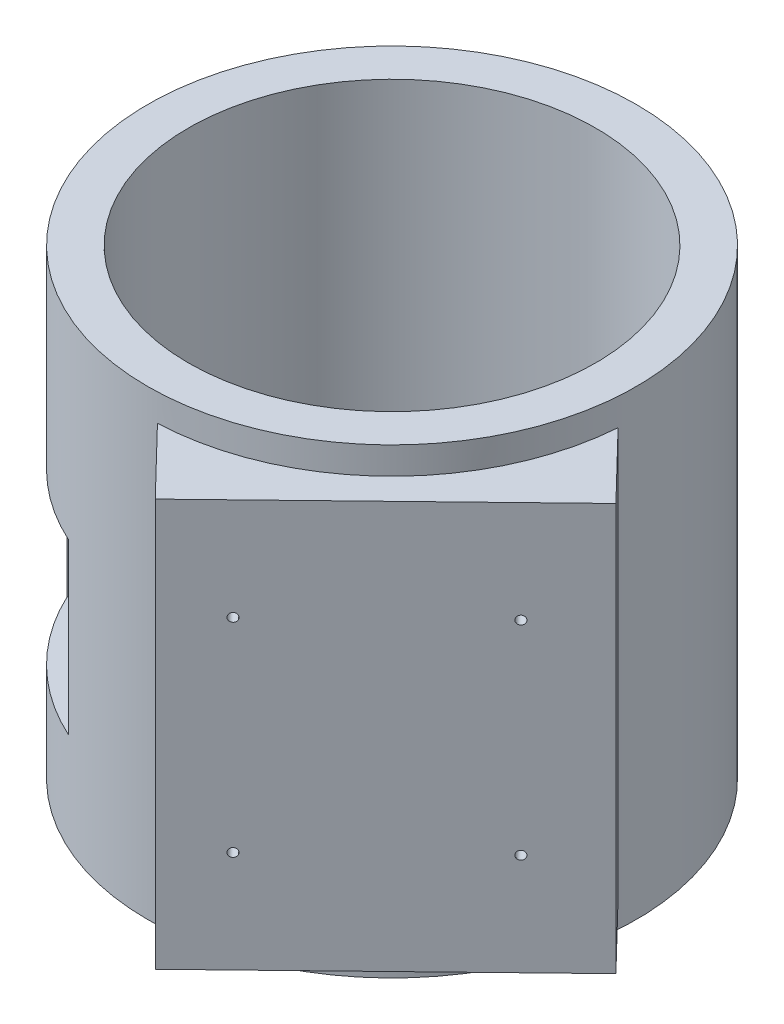
ISO-10303-21;
HEADER;
FILE_DESCRIPTION(('STEP AP214'),'2;1');
FILE_NAME('part.step','',(''),(''),'','','');
FILE_SCHEMA(('AUTOMOTIVE_DESIGN { 1 0 10303 214 1 1 1 1 }'));
ENDSEC;
DATA;
#1=APPLICATION_CONTEXT('core data for automotive mechanical design processes');
#2=APPLICATION_PROTOCOL_DEFINITION('international standard','automotive_design',2000,#1);
#3=PRODUCT_CONTEXT('',#1,'mechanical');
#4=PRODUCT('Part','Part','',(#3));
#5=PRODUCT_RELATED_PRODUCT_CATEGORY('part','',(#4));
#6=PRODUCT_DEFINITION_FORMATION('','',#4);
#7=PRODUCT_DEFINITION_CONTEXT('part definition',#1,'design');
#8=PRODUCT_DEFINITION('design','',#6,#7);
#9=PRODUCT_DEFINITION_SHAPE('','',#8);
#10=(LENGTH_UNIT() NAMED_UNIT(*) SI_UNIT(.MILLI.,.METRE.));
#11=(NAMED_UNIT(*) PLANE_ANGLE_UNIT() SI_UNIT($,.RADIAN.));
#12=(NAMED_UNIT(*) SI_UNIT($,.STERADIAN.) SOLID_ANGLE_UNIT());
#13=UNCERTAINTY_MEASURE_WITH_UNIT(LENGTH_MEASURE(1.E-05),#10,'distance_accuracy_value','');
#14=(GEOMETRIC_REPRESENTATION_CONTEXT(3) GLOBAL_UNCERTAINTY_ASSIGNED_CONTEXT((#13)) GLOBAL_UNIT_ASSIGNED_CONTEXT((#10,
#11,#12)) REPRESENTATION_CONTEXT('',''));
#15=CARTESIAN_POINT('',(0.,0.,0.));
#16=DIRECTION('',(0.,0.,1.));
#17=DIRECTION('',(1.,0.,0.));
#18=AXIS2_PLACEMENT_3D('',#15,#16,#17);
#19=CARTESIAN_POINT('',(0.,226.75,0.));
#20=DIRECTION('',(0.,1.,0.));
#21=DIRECTION('',(0.,0.,1.));
#22=AXIS2_PLACEMENT_3D('',#19,#20,#21);
#23=PLANE('',#22);
#24=CARTESIAN_POINT('',(0.,226.75,0.));
#25=DIRECTION('',(0.,1.,0.));
#26=DIRECTION('',(0.,0.,1.));
#27=AXIS2_PLACEMENT_3D('',#24,#25,#26);
#28=CIRCLE('',#27,120.);
#29=CARTESIAN_POINT('',(0.,226.75,120.));
#30=VERTEX_POINT('',#29);
#31=EDGE_CURVE('E243',#30,#30,#28,.T.);
#32=ORIENTED_EDGE('',*,*,#31,.T.);
#33=EDGE_LOOP('',(#32));
#34=FACE_BOUND('',#33,.T.);
#35=CARTESIAN_POINT('',(0.,226.75,0.));
#36=DIRECTION('',(0.,1.,0.));
#37=DIRECTION('',(0.,0.,1.));
#38=AXIS2_PLACEMENT_3D('',#35,#36,#37);
#39=CIRCLE('',#38,100.);
#40=CARTESIAN_POINT('',(0.,226.75,100.));
#41=VERTEX_POINT('',#40);
#42=EDGE_CURVE('E237',#41,#41,#39,.T.);
#43=ORIENTED_EDGE('',*,*,#42,.F.);
#44=EDGE_LOOP('',(#43));
#45=FACE_BOUND('',#44,.T.);
#46=ADVANCED_FACE('F35',(#34,#45),#23,.T.);
#47=CARTESIAN_POINT('',(0.,0.,0.));
#48=DIRECTION('',(0.,1.,0.));
#49=DIRECTION('',(0.,0.,1.));
#50=AXIS2_PLACEMENT_3D('',#47,#48,#49);
#51=PLANE('',#50);
#52=CARTESIAN_POINT('',(0.,0.,0.));
#53=DIRECTION('',(0.,1.,0.));
#54=DIRECTION('',(0.,0.,1.));
#55=AXIS2_PLACEMENT_3D('',#52,#53,#54);
#56=CIRCLE('',#55,120.);
#57=CARTESIAN_POINT('',(0.,0.,120.));
#58=VERTEX_POINT('',#57);
#59=EDGE_CURVE('E240',#58,#58,#56,.T.);
#60=ORIENTED_EDGE('',*,*,#59,.F.);
#61=EDGE_LOOP('',(#60));
#62=FACE_BOUND('',#61,.T.);
#63=CARTESIAN_POINT('',(0.,0.,0.));
#64=DIRECTION('',(0.,1.,0.));
#65=DIRECTION('',(0.,0.,1.));
#66=AXIS2_PLACEMENT_3D('',#63,#64,#65);
#67=CIRCLE('',#66,100.);
#68=CARTESIAN_POINT('',(0.,0.,100.));
#69=VERTEX_POINT('',#68);
#70=EDGE_CURVE('E236',#69,#69,#67,.T.);
#71=ORIENTED_EDGE('',*,*,#70,.T.);
#72=EDGE_LOOP('',(#71));
#73=FACE_BOUND('',#72,.T.);
#74=ADVANCED_FACE('F291',(#62,#73),#51,.F.);
#75=CARTESIAN_POINT('',(0.,226.75,0.));
#76=DIRECTION('',(0.,-1.,0.));
#77=DIRECTION('',(0.,0.,-1.));
#78=AXIS2_PLACEMENT_3D('',#75,#76,#77);
#79=CYLINDRICAL_SURFACE('',#78,120.);
#80=DIRECTION('',(0.,-1.,0.));
#81=VECTOR('',#80,1.);
#82=CARTESIAN_POINT('',(-108.663981558483,226.75,50.9130544345721));
#83=LINE('',#82,#81);
#84=CARTESIAN_POINT('',(-108.663981558483,48.41,50.9130544345721));
#85=VERTEX_POINT('',#84);
#86=CARTESIAN_POINT('',(-108.663981558483,131.41,50.9130544345721));
#87=VERTEX_POINT('',#86);
#88=EDGE_CURVE('E164',#85,#87,#83,.F.);
#89=ORIENTED_EDGE('',*,*,#88,.T.);
#90=CARTESIAN_POINT('',(0.,131.41,0.));
#91=DIRECTION('',(0.,1.,0.));
#92=DIRECTION('',(0.,0.,1.));
#93=AXIS2_PLACEMENT_3D('',#90,#91,#92);
#94=CIRCLE('',#93,120.);
#95=CARTESIAN_POINT('',(-49.608939813541,131.41,109.265516475128));
#96=VERTEX_POINT('',#95);
#97=EDGE_CURVE('E49',#87,#96,#94,.T.);
#98=ORIENTED_EDGE('',*,*,#97,.T.);
#99=DIRECTION('',(0.,-1.,0.));
#100=VECTOR('',#99,1.);
#101=CARTESIAN_POINT('',(-49.608939813541,226.75,109.265516475128));
#102=LINE('',#101,#100);
#103=CARTESIAN_POINT('',(-49.608939813541,48.41,109.265516475128));
#104=VERTEX_POINT('',#103);
#105=EDGE_CURVE('E11',#96,#104,#102,.T.);
#106=ORIENTED_EDGE('',*,*,#105,.T.);
#107=CARTESIAN_POINT('',(0.,48.41,0.));
#108=DIRECTION('',(0.,-1.,0.));
#109=DIRECTION('',(0.,0.,-1.));
#110=AXIS2_PLACEMENT_3D('',#107,#108,#109);
#111=CIRCLE('',#110,120.);
#112=EDGE_CURVE('E166',#104,#85,#111,.T.);
#113=ORIENTED_EDGE('',*,*,#112,.T.);
#114=EDGE_LOOP('',(#89,#98,#106,#113));
#115=FACE_BOUND('',#114,.T.);
#116=CARTESIAN_POINT('',(0.,213.414213562373,0.));
#117=DIRECTION('',(0.,1.,0.));
#118=DIRECTION('',(-1.,0.,0.));
#119=AXIS2_PLACEMENT_3D('',#116,#117,#118);
#120=CIRCLE('',#119,120.);
#121=CARTESIAN_POINT('',(4.6899926602656,213.414213562373,119.908314844495));
#122=VERTEX_POINT('',#121);
#123=CARTESIAN_POINT('',(119.686951655469,213.414213562374,8.66219391501968));
#124=VERTEX_POINT('',#123);
#125=EDGE_CURVE('E219',#122,#124,#120,.T.);
#126=ORIENTED_EDGE('',*,*,#125,.T.);
#127=DIRECTION('',(0.,-1.,0.));
#128=VECTOR('',#127,1.);
#129=CARTESIAN_POINT('',(119.686951655469,226.75,8.66219391501962));
#130=LINE('',#129,#128);
#131=CARTESIAN_POINT('',(119.686951655469,13.4142135623721,8.6621939150195));
#132=VERTEX_POINT('',#131);
#133=EDGE_CURVE('E233',#124,#132,#130,.T.);
#134=ORIENTED_EDGE('',*,*,#133,.T.);
#135=CARTESIAN_POINT('',(0.,13.4142135623726,0.));
#136=DIRECTION('',(0.,-1.,0.));
#137=DIRECTION('',(1.,0.,0.));
#138=AXIS2_PLACEMENT_3D('',#135,#136,#137);
#139=CIRCLE('',#138,120.);
#140=CARTESIAN_POINT('',(4.68999266026526,13.4142135623732,119.908314844496));
#141=VERTEX_POINT('',#140);
#142=EDGE_CURVE('E230',#132,#141,#139,.T.);
#143=ORIENTED_EDGE('',*,*,#142,.T.);
#144=DIRECTION('',(0.,-1.,0.));
#145=VECTOR('',#144,1.);
#146=CARTESIAN_POINT('',(4.68999266026567,226.75,119.908314844495));
#147=LINE('',#146,#145);
#148=EDGE_CURVE('E227',#141,#122,#147,.F.);
#149=ORIENTED_EDGE('',*,*,#148,.T.);
#150=EDGE_LOOP('',(#126,#134,#143,#149));
#151=FACE_BOUND('',#150,.T.);
#152=ORIENTED_EDGE('',*,*,#31,.F.);
#153=EDGE_LOOP('',(#152));
#154=FACE_BOUND('',#153,.T.);
#155=ORIENTED_EDGE('',*,*,#59,.T.);
#156=EDGE_LOOP('',(#155));
#157=FACE_BOUND('',#156,.T.);
#158=ADVANCED_FACE('F37',(#115,#151,#154,#157),#79,.T.);
#159=CARTESIAN_POINT('',(0.,226.75,0.));
#160=DIRECTION('',(0.,-1.,0.));
#161=DIRECTION('',(0.,0.,-1.));
#162=AXIS2_PLACEMENT_3D('',#159,#160,#161);
#163=CYLINDRICAL_SURFACE('',#162,100.);
#164=CARTESIAN_POINT('',(0.,48.41,0.));
#165=DIRECTION('',(0.,-1.,0.));
#166=DIRECTION('',(0.,0.,-1.));
#167=AXIS2_PLACEMENT_3D('',#164,#165,#166);
#168=CIRCLE('',#167,100.);
#169=CARTESIAN_POINT('',(-36.5772958110317,48.41,93.0704111474333));
#170=VERTEX_POINT('',#169);
#171=CARTESIAN_POINT('',(-93.2824171625184,48.41,36.0331881508964));
#172=VERTEX_POINT('',#171);
#173=EDGE_CURVE('E43',#170,#172,#168,.T.);
#174=ORIENTED_EDGE('',*,*,#173,.F.);
#175=DIRECTION('',(0.,-1.,0.));
#176=VECTOR('',#175,1.);
#177=CARTESIAN_POINT('',(-36.5772958110317,226.75,93.0704111474333));
#178=LINE('',#177,#176);
#179=CARTESIAN_POINT('',(-36.5772958110317,131.41,93.0704111474333));
#180=VERTEX_POINT('',#179);
#181=EDGE_CURVE('E246',#170,#180,#178,.F.);
#182=ORIENTED_EDGE('',*,*,#181,.T.);
#183=CARTESIAN_POINT('',(0.,131.41,0.));
#184=DIRECTION('',(0.,1.,0.));
#185=DIRECTION('',(0.,0.,1.));
#186=AXIS2_PLACEMENT_3D('',#183,#184,#185);
#187=CIRCLE('',#186,100.);
#188=CARTESIAN_POINT('',(-93.2824171625184,131.41,36.0331881508964));
#189=VERTEX_POINT('',#188);
#190=EDGE_CURVE('E142',#189,#180,#187,.T.);
#191=ORIENTED_EDGE('',*,*,#190,.F.);
#192=DIRECTION('',(0.,-1.,0.));
#193=VECTOR('',#192,1.);
#194=CARTESIAN_POINT('',(-93.2824171625184,226.75,36.0331881508963));
#195=LINE('',#194,#193);
#196=EDGE_CURVE('E251',#172,#189,#195,.F.);
#197=ORIENTED_EDGE('',*,*,#196,.F.);
#198=EDGE_LOOP('',(#174,#182,#191,#197));
#199=FACE_BOUND('',#198,.T.);
#200=ORIENTED_EDGE('',*,*,#42,.T.);
#201=EDGE_LOOP('',(#200));
#202=FACE_BOUND('',#201,.T.);
#203=ORIENTED_EDGE('',*,*,#70,.F.);
#204=EDGE_LOOP('',(#203));
#205=FACE_BOUND('',#204,.T.);
#206=CARTESIAN_POINT('',(0.,203.414213562373,0.));
#207=DIRECTION('',(0.,1.,0.));
#208=DIRECTION('',(0.,0.,1.));
#209=AXIS2_PLACEMENT_3D('',#206,#207,#208);
#210=CIRCLE('',#209,99.9999999999977);
#211=CARTESIAN_POINT('',(-0.657656399723929,203.414213562373,99.9978374169134));
#212=VERTEX_POINT('',#211);
#213=CARTESIAN_POINT('',(99.9646827210788,203.414213562373,2.65748160362182));
#214=VERTEX_POINT('',#213);
#215=EDGE_CURVE('E184',#212,#214,#210,.T.);
#216=ORIENTED_EDGE('',*,*,#215,.F.);
#217=DIRECTION('',(0.,1.,0.));
#218=VECTOR('',#217,1.);
#219=CARTESIAN_POINT('',(-0.657656399723934,0.,99.9978374169134));
#220=LINE('',#219,#218);
#221=CARTESIAN_POINT('',(-0.657656399723906,23.414213562373,99.9978374169134));
#222=VERTEX_POINT('',#221);
#223=EDGE_CURVE('E183',#222,#212,#220,.T.);
#224=ORIENTED_EDGE('',*,*,#223,.F.);
#225=CARTESIAN_POINT('',(0.,23.4142135623732,0.));
#226=DIRECTION('',(0.,-1.,0.));
#227=DIRECTION('',(1.,0.,0.));
#228=AXIS2_PLACEMENT_3D('',#225,#226,#227);
#229=CIRCLE('',#228,99.9999999999977);
#230=CARTESIAN_POINT('',(99.9646827210788,23.4142135623735,2.65748160362216));
#231=VERTEX_POINT('',#230);
#232=EDGE_CURVE('E180',#231,#222,#229,.T.);
#233=ORIENTED_EDGE('',*,*,#232,.F.);
#234=DIRECTION('',(0.,1.,0.));
#235=VECTOR('',#234,1.);
#236=CARTESIAN_POINT('',(99.9646827210788,0.,2.65748160362216));
#237=LINE('',#236,#235);
#238=EDGE_CURVE('E187',#214,#231,#237,.F.);
#239=ORIENTED_EDGE('',*,*,#238,.F.);
#240=EDGE_LOOP('',(#216,#224,#233,#239));
#241=FACE_BOUND('',#240,.T.);
#242=ADVANCED_FACE('F261',(#199,#202,#205,#241),#163,.F.);
#243=CARTESIAN_POINT('',(-67.6679309128779,23.4142135623732,-170.627129448513));
#244=DIRECTION('',(0.718730993720023,0.,-0.69528825580922));
#245=DIRECTION('',(-0.69528825580922,0.,-0.718730993720023));
#246=AXIS2_PLACEMENT_3D('',#243,#244,#245);
#247=PLANE('',#246);
#248=DIRECTION('',(0.69528825580922,0.,0.718730993720023));
#249=VECTOR('',#248,1.);
#250=CARTESIAN_POINT('',(-67.6679309128777,203.414213562373,-170.627129448514));
#251=LINE('',#250,#249);
#252=CARTESIAN_POINT('',(137.250013066787,203.414213562373,41.1999455481055));
#253=VERTEX_POINT('',#252);
#254=EDGE_CURVE('E212',#214,#253,#251,.T.);
#255=ORIENTED_EDGE('',*,*,#254,.F.);
#256=ORIENTED_EDGE('',*,*,#238,.T.);
#257=DIRECTION('',(0.69528825580922,0.,0.718730993720023));
#258=VECTOR('',#257,1.);
#259=CARTESIAN_POINT('',(-67.6679309128779,23.4142135623732,-170.627129448513));
#260=LINE('',#259,#258);
#261=CARTESIAN_POINT('',(137.250013066786,23.4142135623732,41.1999455481056));
#262=VERTEX_POINT('',#261);
#263=EDGE_CURVE('E204',#231,#262,#260,.T.);
#264=ORIENTED_EDGE('',*,*,#263,.T.);
#265=DIRECTION('',(0.,1.,0.));
#266=VECTOR('',#265,1.);
#267=CARTESIAN_POINT('',(137.250013066786,23.4142135623732,41.1999455481056));
#268=LINE('',#267,#266);
#269=EDGE_CURVE('E192',#262,#253,#268,.T.);
#270=ORIENTED_EDGE('',*,*,#269,.T.);
#271=EDGE_LOOP('',(#255,#256,#264,#270));
#272=FACE_BOUND('',#271,.T.);
#273=ADVANCED_FACE('F264',(#272),#247,.F.);
#274=CARTESIAN_POINT('',(-128.76006537908,203.414213562373,-111.52762770473));
#275=DIRECTION('',(0.,1.,0.));
#276=DIRECTION('',(0.,0.,1.));
#277=AXIS2_PLACEMENT_3D('',#274,#275,#276);
#278=PLANE('',#277);
#279=DIRECTION('',(0.69528825580922,0.,0.718730993720023));
#280=VECTOR('',#279,1.);
#281=CARTESIAN_POINT('',(-168.290270033681,203.414213562373,-73.2867736352227));
#282=LINE('',#281,#280);
#283=CARTESIAN_POINT('',(36.6276739459833,203.414213562373,138.540301361396));
#284=VERTEX_POINT('',#283);
#285=EDGE_CURVE('E209',#212,#284,#282,.T.);
#286=ORIENTED_EDGE('',*,*,#285,.F.);
#287=ORIENTED_EDGE('',*,*,#215,.T.);
#288=ORIENTED_EDGE('',*,*,#254,.T.);
#289=DIRECTION('',(-0.718730993720023,0.,0.69528825580922));
#290=VECTOR('',#289,1.);
#291=CARTESIAN_POINT('',(76.1578786005845,203.414213562373,100.299447291889));
#292=LINE('',#291,#290);
#293=EDGE_CURVE('E195',#253,#284,#292,.T.);
#294=ORIENTED_EDGE('',*,*,#293,.T.);
#295=EDGE_LOOP('',(#286,#287,#288,#294));
#296=FACE_BOUND('',#295,.T.);
#297=ADVANCED_FACE('F276',(#296),#278,.F.);
#298=CARTESIAN_POINT('',(-168.290270033681,203.414213562373,-73.2867736352227));
#299=DIRECTION('',(-0.718730993720023,0.,0.69528825580922));
#300=DIRECTION('',(0.69528825580922,0.,0.718730993720023));
#301=AXIS2_PLACEMENT_3D('',#298,#299,#300);
#302=PLANE('',#301);
#303=DIRECTION('',(0.69528825580922,0.,0.718730993720023));
#304=VECTOR('',#303,1.);
#305=CARTESIAN_POINT('',(-168.290270033681,23.414213562373,-73.2867736352227));
#306=LINE('',#305,#304);
#307=CARTESIAN_POINT('',(36.6276739459834,23.4142135623729,138.540301361396));
#308=VERTEX_POINT('',#307);
#309=EDGE_CURVE('E205',#222,#308,#306,.T.);
#310=ORIENTED_EDGE('',*,*,#309,.F.);
#311=ORIENTED_EDGE('',*,*,#223,.T.);
#312=ORIENTED_EDGE('',*,*,#285,.T.);
#313=DIRECTION('',(0.,-1.,0.));
#314=VECTOR('',#313,1.);
#315=CARTESIAN_POINT('',(36.6276739459832,203.414213562373,138.540301361396));
#316=LINE('',#315,#314);
#317=EDGE_CURVE('E198',#284,#308,#316,.T.);
#318=ORIENTED_EDGE('',*,*,#317,.T.);
#319=EDGE_LOOP('',(#310,#311,#312,#318));
#320=FACE_BOUND('',#319,.T.);
#321=ADVANCED_FACE('F275',(#320),#302,.F.);
#322=CARTESIAN_POINT('',(-168.290270033681,23.414213562373,-73.2867736352227));
#323=DIRECTION('',(0.,-1.,0.));
#324=DIRECTION('',(1.,0.,0.));
#325=AXIS2_PLACEMENT_3D('',#322,#323,#324);
#326=PLANE('',#325);
#327=ORIENTED_EDGE('',*,*,#263,.F.);
#328=ORIENTED_EDGE('',*,*,#232,.T.);
#329=ORIENTED_EDGE('',*,*,#309,.T.);
#330=DIRECTION('',(0.718730993720025,0.,-0.695288255809218));
#331=VECTOR('',#330,1.);
#332=CARTESIAN_POINT('',(36.627673945983,23.4142135623729,138.540301361396));
#333=LINE('',#332,#331);
#334=EDGE_CURVE('E201',#308,#262,#333,.T.);
#335=ORIENTED_EDGE('',*,*,#334,.T.);
#336=EDGE_LOOP('',(#327,#328,#329,#335));
#337=FACE_BOUND('',#336,.T.);
#338=ADVANCED_FACE('F281',(#337),#326,.F.);
#339=CARTESIAN_POINT('',(-60.4806209756777,213.414213562374,-177.580012006606));
#340=DIRECTION('',(0.718730993720023,0.,-0.69528825580922));
#341=DIRECTION('',(-0.69528825580922,0.,-0.718730993720023));
#342=AXIS2_PLACEMENT_3D('',#339,#340,#341);
#343=PLANE('',#342);
#344=ORIENTED_EDGE('',*,*,#133,.F.);
#345=DIRECTION('',(0.69528825580922,0.,0.718730993720023));
#346=VECTOR('',#345,1.);
#347=CARTESIAN_POINT('',(-60.4806209756777,213.414213562374,-177.580012006606));
#348=LINE('',#347,#346);
#349=CARTESIAN_POINT('',(151.390205562079,213.414213562374,41.4343729272136));
#350=VERTEX_POINT('',#349);
#351=EDGE_CURVE('E222',#124,#350,#348,.T.);
#352=ORIENTED_EDGE('',*,*,#351,.T.);
#353=DIRECTION('',(0.,1.,0.));
#354=VECTOR('',#353,1.);
#355=CARTESIAN_POINT('',(151.390205562079,13.4142135623723,41.4343729272137));
#356=LINE('',#355,#354);
#357=CARTESIAN_POINT('',(151.390205562079,13.4142135623723,41.4343729272137));
#358=VERTEX_POINT('',#357);
#359=EDGE_CURVE('E174',#358,#350,#356,.T.);
#360=ORIENTED_EDGE('',*,*,#359,.F.);
#361=DIRECTION('',(0.69528825580922,0.,0.718730993720023));
#362=VECTOR('',#361,1.);
#363=CARTESIAN_POINT('',(-60.4806209756777,13.4142135623723,-177.580012006606));
#364=LINE('',#363,#362);
#365=EDGE_CURVE('E208',#132,#358,#364,.T.);
#366=ORIENTED_EDGE('',*,*,#365,.F.);
#367=EDGE_LOOP('',(#344,#352,#360,#366));
#368=FACE_BOUND('',#367,.T.);
#369=ADVANCED_FACE('F306',(#368),#343,.T.);
#370=CARTESIAN_POINT('',(-175.477579970882,13.4142135623732,-66.3338910771298));
#371=DIRECTION('',(-0.718730993720023,0.,0.69528825580922));
#372=DIRECTION('',(0.69528825580922,0.,0.718730993720023));
#373=AXIS2_PLACEMENT_3D('',#370,#371,#372);
#374=PLANE('',#373);
#375=ORIENTED_EDGE('',*,*,#148,.F.);
#376=DIRECTION('',(0.69528825580922,0.,0.718730993720023));
#377=VECTOR('',#376,1.);
#378=CARTESIAN_POINT('',(-175.477579970882,13.4142135623732,-66.3338910771298));
#379=LINE('',#378,#377);
#380=CARTESIAN_POINT('',(36.3932465668747,13.4142135623731,152.680493856689));
#381=VERTEX_POINT('',#380);
#382=EDGE_CURVE('E217',#141,#381,#379,.T.);
#383=ORIENTED_EDGE('',*,*,#382,.T.);
#384=DIRECTION('',(0.,-1.,0.));
#385=VECTOR('',#384,1.);
#386=CARTESIAN_POINT('',(36.3932465668751,213.414213562373,152.680493856689));
#387=LINE('',#386,#385);
#388=CARTESIAN_POINT('',(36.3932465668751,213.414213562373,152.680493856689));
#389=VERTEX_POINT('',#388);
#390=EDGE_CURVE('E168',#389,#381,#387,.T.);
#391=ORIENTED_EDGE('',*,*,#390,.F.);
#392=DIRECTION('',(0.69528825580922,0.,0.718730993720023));
#393=VECTOR('',#392,1.);
#394=CARTESIAN_POINT('',(-175.477579970881,213.414213562373,-66.3338910771302));
#395=LINE('',#394,#393);
#396=EDGE_CURVE('E220',#122,#389,#395,.T.);
#397=ORIENTED_EDGE('',*,*,#396,.F.);
#398=EDGE_LOOP('',(#375,#383,#391,#397));
#399=FACE_BOUND('',#398,.T.);
#400=ADVANCED_FACE('F309',(#399),#374,.T.);
#401=CARTESIAN_POINT('',(-175.477579970881,213.414213562373,-66.3338910771302));
#402=DIRECTION('',(0.,1.,0.));
#403=DIRECTION('',(-1.,0.,0.));
#404=AXIS2_PLACEMENT_3D('',#401,#402,#403);
#405=PLANE('',#404);
#406=ORIENTED_EDGE('',*,*,#125,.F.);
#407=ORIENTED_EDGE('',*,*,#396,.T.);
#408=DIRECTION('',(-0.718730993720023,0.,0.695288255809221));
#409=VECTOR('',#408,1.);
#410=CARTESIAN_POINT('',(151.390205562079,213.414213562374,41.4343729272136));
#411=LINE('',#410,#409);
#412=EDGE_CURVE('E177',#350,#389,#411,.T.);
#413=ORIENTED_EDGE('',*,*,#412,.F.);
#414=ORIENTED_EDGE('',*,*,#351,.F.);
#415=EDGE_LOOP('',(#406,#407,#413,#414));
#416=FACE_BOUND('',#415,.T.);
#417=ADVANCED_FACE('F304',(#416),#405,.T.);
#418=CARTESIAN_POINT('',(-60.4806209756777,13.4142135623723,-177.580012006606));
#419=DIRECTION('',(0.,-1.,0.));
#420=DIRECTION('',(1.,0.,0.));
#421=AXIS2_PLACEMENT_3D('',#418,#419,#420);
#422=PLANE('',#421);
#423=ORIENTED_EDGE('',*,*,#142,.F.);
#424=ORIENTED_EDGE('',*,*,#365,.T.);
#425=DIRECTION('',(0.718730993720023,0.,-0.69528825580922));
#426=VECTOR('',#425,1.);
#427=CARTESIAN_POINT('',(36.3932465668747,13.4142135623731,152.680493856689));
#428=LINE('',#427,#426);
#429=EDGE_CURVE('E171',#381,#358,#428,.T.);
#430=ORIENTED_EDGE('',*,*,#429,.F.);
#431=ORIENTED_EDGE('',*,*,#382,.F.);
#432=EDGE_LOOP('',(#423,#424,#430,#431));
#433=FACE_BOUND('',#432,.T.);
#434=ADVANCED_FACE('F300',(#433),#422,.T.);
#435=CARTESIAN_POINT('',(93.8917260644768,0.,97.0574333919515));
#436=DIRECTION('',(0.69528825580922,0.,0.718730993720023));
#437=DIRECTION('',(0.718730993720023,0.,-0.69528825580922));
#438=AXIS2_PLACEMENT_3D('',#435,#436,#437);
#439=PLANE('',#438);
#440=CARTESIAN_POINT('',(55.7989833973156,163.414213562373,133.90771094984));
#441=DIRECTION('',(0.69528825580922,0.,0.718730993720023));
#442=DIRECTION('',(0.718730993720023,0.,-0.69528825580922));
#443=AXIS2_PLACEMENT_3D('',#440,#441,#442);
#444=CIRCLE('',#443,2.09999999999996);
#445=CARTESIAN_POINT('',(57.3083184841277,163.414213562373,132.447605612641));
#446=VERTEX_POINT('',#445);
#447=EDGE_CURVE('E488',#446,#446,#444,.T.);
#448=ORIENTED_EDGE('',*,*,#447,.F.);
#449=EDGE_LOOP('',(#448));
#450=FACE_BOUND('',#449,.T.);
#451=CARTESIAN_POINT('',(127.672082769318,163.414213562373,64.378885368918));
#452=DIRECTION('',(0.69528825580922,0.,0.718730993720023));
#453=DIRECTION('',(0.718730993720023,0.,-0.69528825580922));
#454=AXIS2_PLACEMENT_3D('',#451,#452,#453);
#455=CIRCLE('',#454,2.09999999999996);
#456=CARTESIAN_POINT('',(129.18141785613,163.414213562373,62.9187800317187));
#457=VERTEX_POINT('',#456);
#458=EDGE_CURVE('E490',#457,#457,#455,.T.);
#459=ORIENTED_EDGE('',*,*,#458,.F.);
#460=EDGE_LOOP('',(#459));
#461=FACE_BOUND('',#460,.T.);
#462=CARTESIAN_POINT('',(127.672082769318,63.4142135623727,64.378885368918));
#463=DIRECTION('',(0.69528825580922,0.,0.718730993720023));
#464=DIRECTION('',(0.718730993720023,0.,-0.69528825580922));
#465=AXIS2_PLACEMENT_3D('',#462,#463,#464);
#466=CIRCLE('',#465,2.09999999999996);
#467=CARTESIAN_POINT('',(129.18141785613,63.4142135623727,62.9187800317187));
#468=VERTEX_POINT('',#467);
#469=EDGE_CURVE('E498',#468,#468,#466,.T.);
#470=ORIENTED_EDGE('',*,*,#469,.F.);
#471=EDGE_LOOP('',(#470));
#472=FACE_BOUND('',#471,.T.);
#473=CARTESIAN_POINT('',(55.7989833973156,63.4142135623725,133.90771094984));
#474=DIRECTION('',(0.69528825580922,0.,0.718730993720023));
#475=DIRECTION('',(0.718730993720023,0.,-0.69528825580922));
#476=AXIS2_PLACEMENT_3D('',#473,#474,#475);
#477=CIRCLE('',#476,2.09999999999996);
#478=CARTESIAN_POINT('',(57.3083184841276,63.4142135623725,132.447605612641));
#479=VERTEX_POINT('',#478);
#480=EDGE_CURVE('E151',#479,#479,#477,.T.);
#481=ORIENTED_EDGE('',*,*,#480,.F.);
#482=EDGE_LOOP('',(#481));
#483=FACE_BOUND('',#482,.T.);
#484=ORIENTED_EDGE('',*,*,#390,.T.);
#485=ORIENTED_EDGE('',*,*,#429,.T.);
#486=ORIENTED_EDGE('',*,*,#359,.T.);
#487=ORIENTED_EDGE('',*,*,#412,.T.);
#488=EDGE_LOOP('',(#484,#485,#486,#487));
#489=FACE_BOUND('',#488,.T.);
#490=ADVANCED_FACE('F303',(#450,#461,#472,#483,#489),#439,.T.);
#491=CARTESIAN_POINT('',(86.9388435063845,0.,89.8701234547513));
#492=DIRECTION('',(0.69528825580922,0.,0.718730993720023));
#493=DIRECTION('',(0.718730993720023,0.,-0.69528825580922));
#494=AXIS2_PLACEMENT_3D('',#491,#492,#493);
#495=PLANE('',#494);
#496=CARTESIAN_POINT('',(48.8461008392234,163.414213562373,126.72040101264));
#497=DIRECTION('',(0.69528825580922,0.,0.718730993720023));
#498=DIRECTION('',(0.718730993720023,0.,-0.69528825580922));
#499=AXIS2_PLACEMENT_3D('',#496,#497,#498);
#500=CIRCLE('',#499,2.09999999999998);
#501=CARTESIAN_POINT('',(50.3554359260354,163.414213562373,125.260295675441));
#502=VERTEX_POINT('',#501);
#503=EDGE_CURVE('E486',#502,#502,#500,.T.);
#504=ORIENTED_EDGE('',*,*,#503,.T.);
#505=EDGE_LOOP('',(#504));
#506=FACE_BOUND('',#505,.T.);
#507=CARTESIAN_POINT('',(120.719200211226,163.414213562373,57.1915754317178));
#508=DIRECTION('',(0.69528825580922,0.,0.718730993720023));
#509=DIRECTION('',(0.718730993720023,0.,-0.69528825580922));
#510=AXIS2_PLACEMENT_3D('',#507,#508,#509);
#511=CIRCLE('',#510,2.09999999999998);
#512=CARTESIAN_POINT('',(122.228535298038,163.414213562373,55.7314700945184));
#513=VERTEX_POINT('',#512);
#514=EDGE_CURVE('E495',#513,#513,#511,.T.);
#515=ORIENTED_EDGE('',*,*,#514,.T.);
#516=EDGE_LOOP('',(#515));
#517=FACE_BOUND('',#516,.T.);
#518=CARTESIAN_POINT('',(120.719200211226,63.4142135623727,57.1915754317178));
#519=DIRECTION('',(0.69528825580922,0.,0.718730993720023));
#520=DIRECTION('',(0.718730993720023,0.,-0.69528825580922));
#521=AXIS2_PLACEMENT_3D('',#518,#519,#520);
#522=CIRCLE('',#521,2.09999999999998);
#523=CARTESIAN_POINT('',(122.228535298038,63.4142135623727,55.7314700945184));
#524=VERTEX_POINT('',#523);
#525=EDGE_CURVE('E501',#524,#524,#522,.T.);
#526=ORIENTED_EDGE('',*,*,#525,.T.);
#527=EDGE_LOOP('',(#526));
#528=FACE_BOUND('',#527,.T.);
#529=CARTESIAN_POINT('',(48.8461008392234,63.4142135623725,126.72040101264));
#530=DIRECTION('',(0.69528825580922,0.,0.718730993720023));
#531=DIRECTION('',(0.718730993720023,0.,-0.69528825580922));
#532=AXIS2_PLACEMENT_3D('',#529,#530,#531);
#533=CIRCLE('',#532,2.09999999999998);
#534=CARTESIAN_POINT('',(50.3554359260354,63.4142135623725,125.260295675441));
#535=VERTEX_POINT('',#534);
#536=EDGE_CURVE('E148',#535,#535,#533,.T.);
#537=ORIENTED_EDGE('',*,*,#536,.T.);
#538=EDGE_LOOP('',(#537));
#539=FACE_BOUND('',#538,.T.);
#540=ORIENTED_EDGE('',*,*,#293,.F.);
#541=ORIENTED_EDGE('',*,*,#269,.F.);
#542=ORIENTED_EDGE('',*,*,#334,.F.);
#543=ORIENTED_EDGE('',*,*,#317,.F.);
#544=EDGE_LOOP('',(#540,#541,#542,#543));
#545=FACE_BOUND('',#544,.T.);
#546=ADVANCED_FACE('F278',(#506,#517,#528,#539,#545),#495,.F.);
#547=CARTESIAN_POINT('',(-34.7840256426849,131.41,94.9241442420681));
#548=DIRECTION('',(0.695288255809221,0.,0.718730993720023));
#549=DIRECTION('',(0.718730993720023,0.,-0.695288255809221));
#550=AXIS2_PLACEMENT_3D('',#547,#548,#549);
#551=PLANE('',#550);
#552=DIRECTION('',(-0.718730993720023,0.,0.695288255809221));
#553=VECTOR('',#552,1.);
#554=CARTESIAN_POINT('',(-34.7840256426849,131.41,94.9241442420681));
#555=LINE('',#554,#553);
#556=CARTESIAN_POINT('',(-34.7840256426849,131.41,94.9241442420681));
#557=VERTEX_POINT('',#556);
#558=EDGE_CURVE('E131',#557,#96,#555,.T.);
#559=ORIENTED_EDGE('',*,*,#558,.F.);
#560=DIRECTION('',(0.,1.,0.));
#561=VECTOR('',#560,1.);
#562=CARTESIAN_POINT('',(-34.7840256426849,131.41,94.9241442420681));
#563=LINE('',#562,#561);
#564=CARTESIAN_POINT('',(-34.7840256426849,48.41,94.9241442420681));
#565=VERTEX_POINT('',#564);
#566=EDGE_CURVE('E134',#565,#557,#563,.T.);
#567=ORIENTED_EDGE('',*,*,#566,.F.);
#568=DIRECTION('',(-0.718730993720023,0.,0.695288255809221));
#569=VECTOR('',#568,1.);
#570=CARTESIAN_POINT('',(-34.7840256426849,48.41,94.9241442420681));
#571=LINE('',#570,#569);
#572=EDGE_CURVE('E156',#565,#104,#571,.T.);
#573=ORIENTED_EDGE('',*,*,#572,.T.);
#574=ORIENTED_EDGE('',*,*,#105,.F.);
#575=EDGE_LOOP('',(#559,#567,#573,#574));
#576=FACE_BOUND('',#575,.T.);
#577=ADVANCED_FACE('F132',(#576),#551,.F.);
#578=CARTESIAN_POINT('',(-92.4929508748502,48.41,35.2694717633061));
#579=DIRECTION('',(0.,-1.,0.));
#580=DIRECTION('',(0.,0.,-1.));
#581=AXIS2_PLACEMENT_3D('',#578,#579,#580);
#582=PLANE('',#581);
#583=ORIENTED_EDGE('',*,*,#572,.F.);
#584=DIRECTION('',(0.695288255809221,0.,0.718730993720023));
#585=VECTOR('',#584,1.);
#586=CARTESIAN_POINT('',(-92.4929508748502,48.41,35.2694717633061));
#587=LINE('',#586,#585);
#588=EDGE_CURVE('E137',#170,#565,#587,.T.);
#589=ORIENTED_EDGE('',*,*,#588,.F.);
#590=ORIENTED_EDGE('',*,*,#173,.T.);
#591=DIRECTION('',(-0.718730993720023,0.,0.695288255809221));
#592=VECTOR('',#591,1.);
#593=CARTESIAN_POINT('',(-92.4929508748502,48.41,35.2694717633061));
#594=LINE('',#593,#592);
#595=EDGE_CURVE('E158',#172,#85,#594,.T.);
#596=ORIENTED_EDGE('',*,*,#595,.T.);
#597=ORIENTED_EDGE('',*,*,#112,.F.);
#598=EDGE_LOOP('',(#583,#589,#590,#596,#597));
#599=FACE_BOUND('',#598,.T.);
#600=ADVANCED_FACE('F255',(#599),#582,.F.);
#601=CARTESIAN_POINT('',(-92.4929508748502,131.41,35.2694717633061));
#602=DIRECTION('',(-0.695288255809221,0.,-0.718730993720023));
#603=DIRECTION('',(-0.718730993720023,0.,0.695288255809221));
#604=AXIS2_PLACEMENT_3D('',#601,#602,#603);
#605=PLANE('',#604);
#606=ORIENTED_EDGE('',*,*,#595,.F.);
#607=ORIENTED_EDGE('',*,*,#196,.T.);
#608=DIRECTION('',(-0.718730993720023,0.,0.695288255809221));
#609=VECTOR('',#608,1.);
#610=CARTESIAN_POINT('',(-92.4929508748502,131.41,35.2694717633061));
#611=LINE('',#610,#609);
#612=EDGE_CURVE('E136',#189,#87,#611,.T.);
#613=ORIENTED_EDGE('',*,*,#612,.T.);
#614=ORIENTED_EDGE('',*,*,#88,.F.);
#615=EDGE_LOOP('',(#606,#607,#613,#614));
#616=FACE_BOUND('',#615,.T.);
#617=ADVANCED_FACE('F260',(#616),#605,.F.);
#618=CARTESIAN_POINT('',(-92.4929508748502,131.41,35.2694717633061));
#619=DIRECTION('',(0.,1.,0.));
#620=DIRECTION('',(0.,0.,1.));
#621=AXIS2_PLACEMENT_3D('',#618,#619,#620);
#622=PLANE('',#621);
#623=ORIENTED_EDGE('',*,*,#612,.F.);
#624=ORIENTED_EDGE('',*,*,#190,.T.);
#625=DIRECTION('',(-0.695288255809221,0.,-0.718730993720023));
#626=VECTOR('',#625,1.);
#627=CARTESIAN_POINT('',(-92.4929508748502,131.41,35.2694717633061));
#628=LINE('',#627,#626);
#629=EDGE_CURVE('E57',#557,#180,#628,.T.);
#630=ORIENTED_EDGE('',*,*,#629,.F.);
#631=ORIENTED_EDGE('',*,*,#558,.T.);
#632=ORIENTED_EDGE('',*,*,#97,.F.);
#633=EDGE_LOOP('',(#623,#624,#630,#631,#632));
#634=FACE_BOUND('',#633,.T.);
#635=ADVANCED_FACE('F140',(#634),#622,.F.);
#636=CARTESIAN_POINT('',(-65.4045204285221,0.,63.2712312786391));
#637=DIRECTION('',(-0.718730993720023,0.,0.695288255809221));
#638=DIRECTION('',(0.695288255809221,0.,0.718730993720023));
#639=AXIS2_PLACEMENT_3D('',#636,#637,#638);
#640=PLANE('',#639);
#641=ORIENTED_EDGE('',*,*,#588,.T.);
#642=ORIENTED_EDGE('',*,*,#566,.T.);
#643=ORIENTED_EDGE('',*,*,#629,.T.);
#644=ORIENTED_EDGE('',*,*,#181,.F.);
#645=EDGE_LOOP('',(#641,#642,#643,#644));
#646=FACE_BOUND('',#645,.T.);
#647=ADVANCED_FACE('F145',(#646),#640,.T.);
#648=CARTESIAN_POINT('',(55.7989833973156,63.4142135623725,133.90771094984));
#649=DIRECTION('',(0.69528825580922,0.,0.718730993720023));
#650=DIRECTION('',(0.718730993720023,0.,-0.69528825580922));
#651=AXIS2_PLACEMENT_3D('',#648,#649,#650);
#652=CYLINDRICAL_SURFACE('',#651,2.09999999999998);
#653=ORIENTED_EDGE('',*,*,#536,.F.);
#654=EDGE_LOOP('',(#653));
#655=FACE_BOUND('',#654,.T.);
#656=ORIENTED_EDGE('',*,*,#480,.T.);
#657=EDGE_LOOP('',(#656));
#658=FACE_BOUND('',#657,.T.);
#659=ADVANCED_FACE('F431',(#655,#658),#652,.F.);
#660=CARTESIAN_POINT('',(127.672082769318,63.4142135623727,64.378885368918));
#661=DIRECTION('',(0.69528825580922,0.,0.718730993720023));
#662=DIRECTION('',(0.718730993720023,0.,-0.69528825580922));
#663=AXIS2_PLACEMENT_3D('',#660,#661,#662);
#664=CYLINDRICAL_SURFACE('',#663,2.09999999999998);
#665=ORIENTED_EDGE('',*,*,#525,.F.);
#666=EDGE_LOOP('',(#665));
#667=FACE_BOUND('',#666,.T.);
#668=ORIENTED_EDGE('',*,*,#469,.T.);
#669=EDGE_LOOP('',(#668));
#670=FACE_BOUND('',#669,.T.);
#671=ADVANCED_FACE('F449',(#667,#670),#664,.F.);
#672=CARTESIAN_POINT('',(127.672082769318,163.414213562373,64.378885368918));
#673=DIRECTION('',(0.69528825580922,0.,0.718730993720023));
#674=DIRECTION('',(0.718730993720023,0.,-0.69528825580922));
#675=AXIS2_PLACEMENT_3D('',#672,#673,#674);
#676=CYLINDRICAL_SURFACE('',#675,2.09999999999998);
#677=ORIENTED_EDGE('',*,*,#514,.F.);
#678=EDGE_LOOP('',(#677));
#679=FACE_BOUND('',#678,.T.);
#680=ORIENTED_EDGE('',*,*,#458,.T.);
#681=EDGE_LOOP('',(#680));
#682=FACE_BOUND('',#681,.T.);
#683=ADVANCED_FACE('F459',(#679,#682),#676,.F.);
#684=CARTESIAN_POINT('',(55.7989833973156,163.414213562373,133.90771094984));
#685=DIRECTION('',(0.69528825580922,0.,0.718730993720023));
#686=DIRECTION('',(0.718730993720023,0.,-0.69528825580922));
#687=AXIS2_PLACEMENT_3D('',#684,#685,#686);
#688=CYLINDRICAL_SURFACE('',#687,2.09999999999998);
#689=ORIENTED_EDGE('',*,*,#503,.F.);
#690=EDGE_LOOP('',(#689));
#691=FACE_BOUND('',#690,.T.);
#692=ORIENTED_EDGE('',*,*,#447,.T.);
#693=EDGE_LOOP('',(#692));
#694=FACE_BOUND('',#693,.T.);
#695=ADVANCED_FACE('F469',(#691,#694),#688,.F.);
#696=CLOSED_SHELL('',(#46,#74,#158,#242,#273,#297,#321,#338,#369,#400,#417,#434,#490,#546,#577,
#600,#617,#635,#647,#659,#671,#683,#695));
#697=MANIFOLD_SOLID_BREP('B2',#696);
#698=ADVANCED_BREP_SHAPE_REPRESENTATION('',(#18,#697),#14);
#699=SHAPE_DEFINITION_REPRESENTATION(#9,#698);
ENDSEC;
END-ISO-10303-21;
